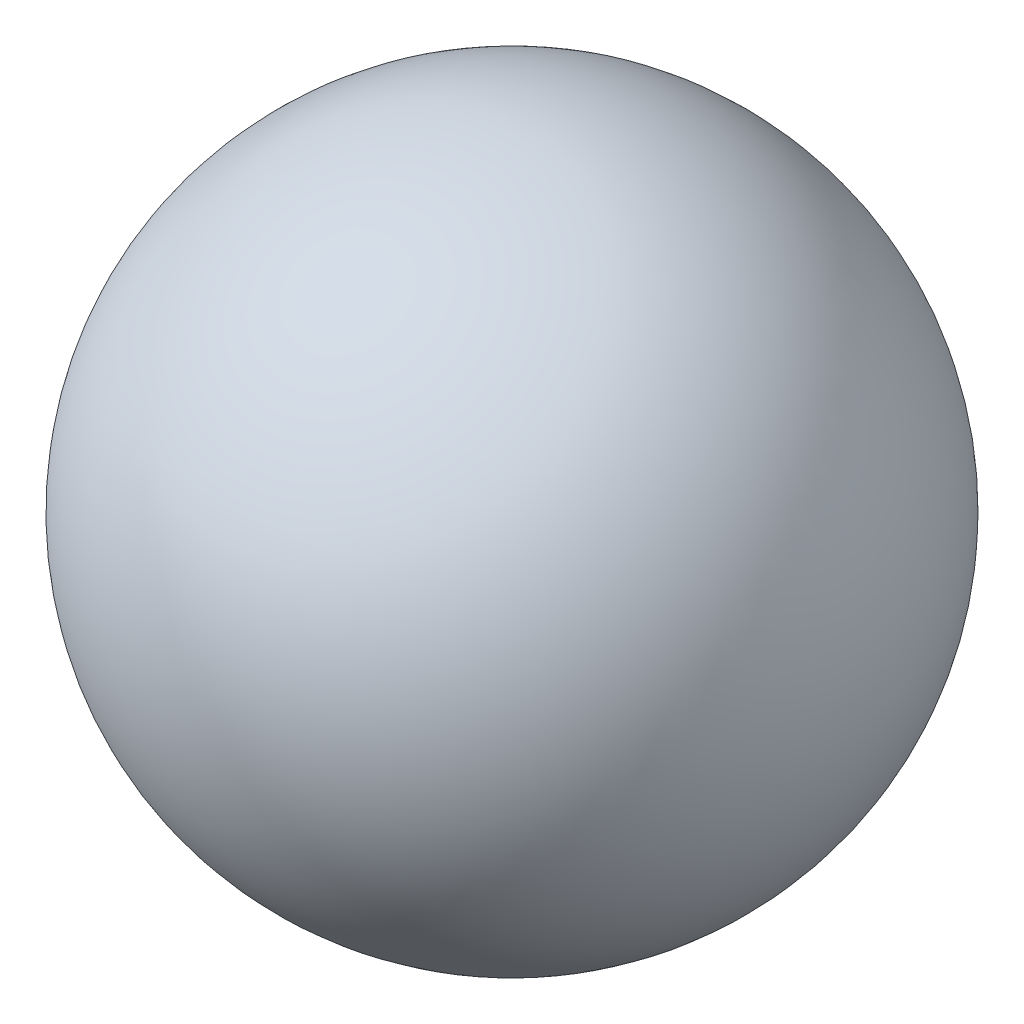
ISO-10303-21;
HEADER;
FILE_DESCRIPTION(('STEP AP214'),'2;1');
FILE_NAME('part.step','',(''),(''),'','','');
FILE_SCHEMA(('AUTOMOTIVE_DESIGN { 1 0 10303 214 1 1 1 1 }'));
ENDSEC;
DATA;
#1=APPLICATION_CONTEXT('core data for automotive mechanical design processes');
#2=APPLICATION_PROTOCOL_DEFINITION('international standard','automotive_design',2000,#1);
#3=PRODUCT_CONTEXT('',#1,'mechanical');
#4=PRODUCT('Part','Part','',(#3));
#5=PRODUCT_RELATED_PRODUCT_CATEGORY('part','',(#4));
#6=PRODUCT_DEFINITION_FORMATION('','',#4);
#7=PRODUCT_DEFINITION_CONTEXT('part definition',#1,'design');
#8=PRODUCT_DEFINITION('design','',#6,#7);
#9=PRODUCT_DEFINITION_SHAPE('','',#8);
#10=(LENGTH_UNIT() NAMED_UNIT(*) SI_UNIT(.MILLI.,.METRE.));
#11=(NAMED_UNIT(*) PLANE_ANGLE_UNIT() SI_UNIT($,.RADIAN.));
#12=(NAMED_UNIT(*) SI_UNIT($,.STERADIAN.) SOLID_ANGLE_UNIT());
#13=UNCERTAINTY_MEASURE_WITH_UNIT(LENGTH_MEASURE(1.E-05),#10,'distance_accuracy_value','');
#14=(GEOMETRIC_REPRESENTATION_CONTEXT(3) GLOBAL_UNCERTAINTY_ASSIGNED_CONTEXT((#13)) GLOBAL_UNIT_ASSIGNED_CONTEXT((#10,
#11,#12)) REPRESENTATION_CONTEXT('',''));
#15=CARTESIAN_POINT('',(0.,0.,0.));
#16=DIRECTION('',(0.,0.,1.));
#17=DIRECTION('',(1.,0.,0.));
#18=AXIS2_PLACEMENT_3D('',#15,#16,#17);
#19=CARTESIAN_POINT('',(0.,0.,0.));
#20=DIRECTION('',(0.,-1.,0.));
#21=DIRECTION('',(-1.,0.,0.));
#22=AXIS2_PLACEMENT_3D('',#19,#20,#21);
#23=SPHERICAL_SURFACE('',#22,43.6292523281218);
#24=CARTESIAN_POINT('',(0.,-43.3418003630551,0.));
#25=DIRECTION('',(0.,1.,0.));
#26=DIRECTION('',(-1.,0.,0.));
#27=AXIS2_PLACEMENT_3D('',#24,#25,#26);
#28=CIRCLE('',#27,5.);
#29=CARTESIAN_POINT('',(-4.99999999999999,-43.3418003630551,0.));
#30=VERTEX_POINT('',#29);
#31=EDGE_CURVE('E10',#30,#30,#28,.T.);
#32=ORIENTED_EDGE('',*,*,#31,.T.);
#33=EDGE_LOOP('',(#32));
#34=FACE_BOUND('',#33,.T.);
#35=ADVANCED_FACE('F37',(#34),#23,.T.);
#36=CARTESIAN_POINT('',(0.,0.,0.));
#37=DIRECTION('',(0.,1.,0.));
#38=DIRECTION('',(-1.,0.,0.));
#39=AXIS2_PLACEMENT_3D('',#36,#37,#38);
#40=CYLINDRICAL_SURFACE('',#39,5.);
#41=ORIENTED_EDGE('',*,*,#31,.F.);
#42=EDGE_LOOP('',(#41));
#43=FACE_BOUND('',#42,.T.);
#44=CARTESIAN_POINT('',(0.,0.,0.));
#45=DIRECTION('',(0.,1.,0.));
#46=DIRECTION('',(-1.,0.,0.));
#47=AXIS2_PLACEMENT_3D('',#44,#45,#46);
#48=CIRCLE('',#47,5.);
#49=CARTESIAN_POINT('',(-5.,0.,0.));
#50=VERTEX_POINT('',#49);
#51=EDGE_CURVE('E43',#50,#50,#48,.T.);
#52=ORIENTED_EDGE('',*,*,#51,.T.);
#53=EDGE_LOOP('',(#52));
#54=FACE_BOUND('',#53,.T.);
#55=ADVANCED_FACE('F49',(#43,#54),#40,.F.);
#56=CARTESIAN_POINT('',(0.,0.,0.));
#57=DIRECTION('',(0.,-1.,0.));
#58=DIRECTION('',(1.,0.,0.));
#59=AXIS2_PLACEMENT_3D('',#56,#57,#58);
#60=PLANE('',#59);
#61=ORIENTED_EDGE('',*,*,#51,.F.);
#62=EDGE_LOOP('',(#61));
#63=FACE_BOUND('',#62,.T.);
#64=ADVANCED_FACE('F51',(#63),#60,.T.);
#65=CLOSED_SHELL('',(#35,#55,#64));
#66=MANIFOLD_SOLID_BREP('B2',#65);
#67=ADVANCED_BREP_SHAPE_REPRESENTATION('',(#18,#66),#14);
#68=SHAPE_DEFINITION_REPRESENTATION(#9,#67);
ENDSEC;
END-ISO-10303-21;
